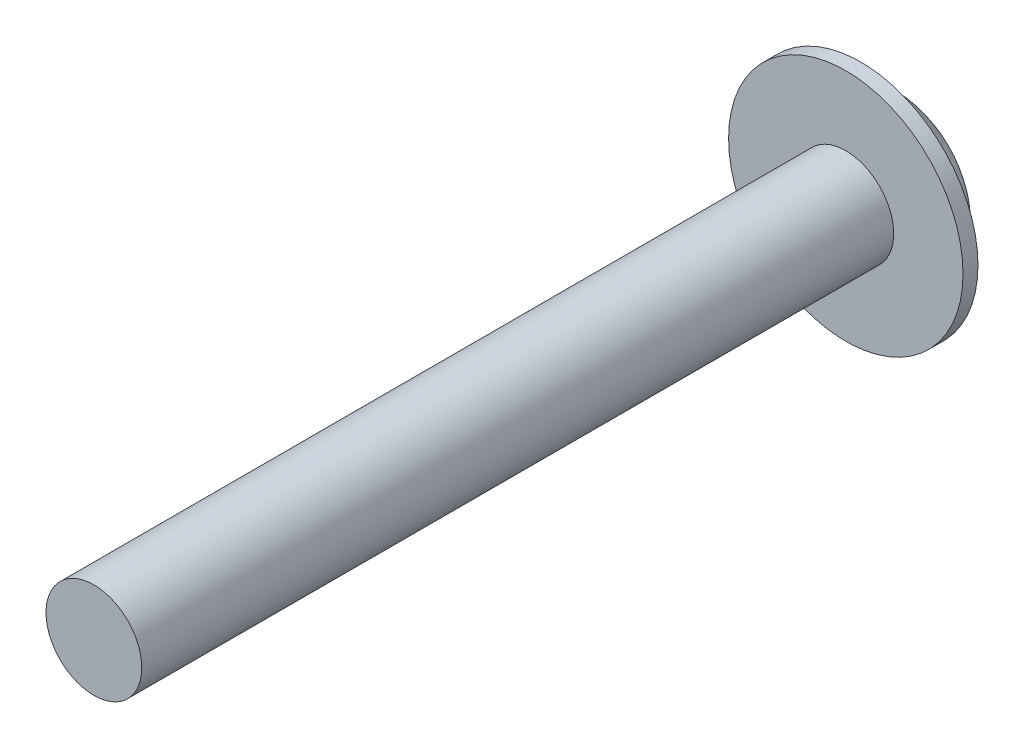
ISO-10303-21;
HEADER;
FILE_DESCRIPTION(('STEP AP214'),'2;1');
FILE_NAME('part.step','',(''),(''),'','','');
FILE_SCHEMA(('AUTOMOTIVE_DESIGN { 1 0 10303 214 1 1 1 1 }'));
ENDSEC;
DATA;
#1=APPLICATION_CONTEXT('core data for automotive mechanical design processes');
#2=APPLICATION_PROTOCOL_DEFINITION('international standard','automotive_design',2000,#1);
#3=PRODUCT_CONTEXT('',#1,'mechanical');
#4=PRODUCT('Part','Part','',(#3));
#5=PRODUCT_RELATED_PRODUCT_CATEGORY('part','',(#4));
#6=PRODUCT_DEFINITION_FORMATION('','',#4);
#7=PRODUCT_DEFINITION_CONTEXT('part definition',#1,'design');
#8=PRODUCT_DEFINITION('design','',#6,#7);
#9=PRODUCT_DEFINITION_SHAPE('','',#8);
#10=(LENGTH_UNIT() NAMED_UNIT(*) SI_UNIT(.MILLI.,.METRE.));
#11=(NAMED_UNIT(*) PLANE_ANGLE_UNIT() SI_UNIT($,.RADIAN.));
#12=(NAMED_UNIT(*) SI_UNIT($,.STERADIAN.) SOLID_ANGLE_UNIT());
#13=UNCERTAINTY_MEASURE_WITH_UNIT(LENGTH_MEASURE(1.E-05),#10,'distance_accuracy_value','');
#14=(GEOMETRIC_REPRESENTATION_CONTEXT(3) GLOBAL_UNCERTAINTY_ASSIGNED_CONTEXT((#13)) GLOBAL_UNIT_ASSIGNED_CONTEXT((#10,
#11,#12)) REPRESENTATION_CONTEXT('',''));
#15=CARTESIAN_POINT('',(0.,0.,0.));
#16=DIRECTION('',(0.,0.,1.));
#17=DIRECTION('',(1.,0.,0.));
#18=AXIS2_PLACEMENT_3D('',#15,#16,#17);
#19=CARTESIAN_POINT('',(0.,0.,-0.381));
#20=DIRECTION('',(0.,0.,-1.));
#21=DIRECTION('',(-1.,0.,0.));
#22=AXIS2_PLACEMENT_3D('',#19,#20,#21);
#23=PLANE('',#22);
#24=CARTESIAN_POINT('',(0.,0.,-0.381));
#25=DIRECTION('',(0.,0.,-1.));
#26=DIRECTION('',(-1.,0.,0.));
#27=AXIS2_PLACEMENT_3D('',#24,#25,#26);
#28=CIRCLE('',#27,2.9845);
#29=CARTESIAN_POINT('',(2.9845,0.,-0.381));
#30=VERTEX_POINT('',#29);
#31=EDGE_CURVE('E50',#30,#30,#28,.T.);
#32=ORIENTED_EDGE('',*,*,#31,.T.);
#33=EDGE_LOOP('',(#32));
#34=FACE_BOUND('',#33,.T.);
#35=CARTESIAN_POINT('',(0.,0.,-0.381));
#36=DIRECTION('',(0.,0.,-1.));
#37=DIRECTION('',(-1.,0.,0.));
#38=AXIS2_PLACEMENT_3D('',#35,#36,#37);
#39=CIRCLE('',#38,2.2479);
#40=CARTESIAN_POINT('',(-2.2479,0.,-0.381));
#41=VERTEX_POINT('',#40);
#42=EDGE_CURVE('E54',#41,#41,#39,.T.);
#43=ORIENTED_EDGE('',*,*,#42,.F.);
#44=EDGE_LOOP('',(#43));
#45=FACE_BOUND('',#44,.T.);
#46=ADVANCED_FACE('F30',(#34,#45),#23,.T.);
#47=CARTESIAN_POINT('',(0.,0.,19.144));
#48=DIRECTION('',(0.,0.,-1.));
#49=DIRECTION('',(-1.,0.,0.));
#50=AXIS2_PLACEMENT_3D('',#47,#48,#49);
#51=CYLINDRICAL_SURFACE('',#50,1.2192);
#52=CARTESIAN_POINT('',(0.,0.,19.144));
#53=DIRECTION('',(0.,0.,1.));
#54=DIRECTION('',(1.,0.,0.));
#55=AXIS2_PLACEMENT_3D('',#52,#53,#54);
#56=CIRCLE('',#55,1.2192);
#57=CARTESIAN_POINT('',(1.2192,0.,19.144));
#58=VERTEX_POINT('',#57);
#59=EDGE_CURVE('E41',#58,#58,#56,.T.);
#60=ORIENTED_EDGE('',*,*,#59,.F.);
#61=EDGE_LOOP('',(#60));
#62=FACE_BOUND('',#61,.T.);
#63=CARTESIAN_POINT('',(0.,0.,0.));
#64=DIRECTION('',(0.,0.,-1.));
#65=DIRECTION('',(-1.,0.,0.));
#66=AXIS2_PLACEMENT_3D('',#63,#64,#65);
#67=CIRCLE('',#66,1.2192);
#68=CARTESIAN_POINT('',(-1.2192,0.,0.));
#69=VERTEX_POINT('',#68);
#70=EDGE_CURVE('E45',#69,#69,#67,.T.);
#71=ORIENTED_EDGE('',*,*,#70,.F.);
#72=EDGE_LOOP('',(#71));
#73=FACE_BOUND('',#72,.T.);
#74=ADVANCED_FACE('F63',(#62,#73),#51,.T.);
#75=CARTESIAN_POINT('',(0.,0.,19.144));
#76=DIRECTION('',(0.,0.,1.));
#77=DIRECTION('',(1.,0.,0.));
#78=AXIS2_PLACEMENT_3D('',#75,#76,#77);
#79=PLANE('',#78);
#80=ORIENTED_EDGE('',*,*,#59,.T.);
#81=EDGE_LOOP('',(#80));
#82=FACE_BOUND('',#81,.T.);
#83=ADVANCED_FACE('F69',(#82),#79,.T.);
#84=CARTESIAN_POINT('',(0.,0.,0.));
#85=DIRECTION('',(0.,0.,-1.));
#86=DIRECTION('',(-1.,0.,0.));
#87=AXIS2_PLACEMENT_3D('',#84,#85,#86);
#88=PLANE('',#87);
#89=CARTESIAN_POINT('',(0.,0.,0.));
#90=DIRECTION('',(0.,0.,-1.));
#91=DIRECTION('',(-1.,0.,0.));
#92=AXIS2_PLACEMENT_3D('',#89,#90,#91);
#93=CIRCLE('',#92,2.9845);
#94=CARTESIAN_POINT('',(2.9845,0.,0.));
#95=VERTEX_POINT('',#94);
#96=EDGE_CURVE('E51',#95,#95,#93,.T.);
#97=ORIENTED_EDGE('',*,*,#96,.F.);
#98=EDGE_LOOP('',(#97));
#99=FACE_BOUND('',#98,.T.);
#100=ORIENTED_EDGE('',*,*,#70,.T.);
#101=EDGE_LOOP('',(#100));
#102=FACE_BOUND('',#101,.T.);
#103=ADVANCED_FACE('F74',(#99,#102),#88,.F.);
#104=CARTESIAN_POINT('',(0.,0.,-0.381));
#105=DIRECTION('',(0.,0.,1.));
#106=DIRECTION('',(1.,0.,0.));
#107=AXIS2_PLACEMENT_3D('',#104,#105,#106);
#108=CYLINDRICAL_SURFACE('',#107,2.9845);
#109=CARTESIAN_POINT('',(2.9845,0.,-0.381));
#110=CARTESIAN_POINT('',(2.9845,0.,-0.37703125));
#111=CARTESIAN_POINT('',(2.9845,0.,-0.3730625));
#112=CARTESIAN_POINT('',(2.9845,0.,-0.365125));
#113=CARTESIAN_POINT('',(2.9845,0.,-0.36115625));
#114=CARTESIAN_POINT('',(2.9845,0.,-0.35321875));
#115=CARTESIAN_POINT('',(2.9845,0.,-0.34925));
#116=CARTESIAN_POINT('',(2.9845,0.,-0.3413125));
#117=CARTESIAN_POINT('',(2.9845,0.,-0.33734375));
#118=CARTESIAN_POINT('',(2.9845,0.,-0.32940625));
#119=CARTESIAN_POINT('',(2.9845,0.,-0.3254375));
#120=CARTESIAN_POINT('',(2.9845,0.,-0.3175));
#121=CARTESIAN_POINT('',(2.9845,0.,-0.31353125));
#122=CARTESIAN_POINT('',(2.9845,0.,-0.30559375));
#123=CARTESIAN_POINT('',(2.9845,0.,-0.301625));
#124=CARTESIAN_POINT('',(2.9845,0.,-0.2936875));
#125=CARTESIAN_POINT('',(2.9845,0.,-0.28971875));
#126=CARTESIAN_POINT('',(2.9845,0.,-0.28178125));
#127=CARTESIAN_POINT('',(2.9845,0.,-0.2778125));
#128=CARTESIAN_POINT('',(2.9845,0.,-0.269875));
#129=CARTESIAN_POINT('',(2.9845,0.,-0.26590625));
#130=CARTESIAN_POINT('',(2.9845,0.,-0.25796875));
#131=CARTESIAN_POINT('',(2.9845,0.,-0.254));
#132=CARTESIAN_POINT('',(2.9845,0.,-0.2460625));
#133=CARTESIAN_POINT('',(2.9845,0.,-0.24209375));
#134=CARTESIAN_POINT('',(2.9845,0.,-0.23415625));
#135=CARTESIAN_POINT('',(2.9845,0.,-0.2301875));
#136=CARTESIAN_POINT('',(2.9845,0.,-0.22225));
#137=CARTESIAN_POINT('',(2.9845,0.,-0.21828125));
#138=CARTESIAN_POINT('',(2.9845,0.,-0.21034375));
#139=CARTESIAN_POINT('',(2.9845,0.,-0.206375));
#140=CARTESIAN_POINT('',(2.9845,0.,-0.1984375));
#141=CARTESIAN_POINT('',(2.9845,0.,-0.19446875));
#142=CARTESIAN_POINT('',(2.9845,0.,-0.18653125));
#143=CARTESIAN_POINT('',(2.9845,0.,-0.1825625));
#144=CARTESIAN_POINT('',(2.9845,0.,-0.174625));
#145=CARTESIAN_POINT('',(2.9845,0.,-0.17065625));
#146=CARTESIAN_POINT('',(2.9845,0.,-0.16271875));
#147=CARTESIAN_POINT('',(2.9845,0.,-0.15875));
#148=CARTESIAN_POINT('',(2.9845,0.,-0.1508125));
#149=CARTESIAN_POINT('',(2.9845,0.,-0.14684375));
#150=CARTESIAN_POINT('',(2.9845,0.,-0.13890625));
#151=CARTESIAN_POINT('',(2.9845,0.,-0.1349375));
#152=CARTESIAN_POINT('',(2.9845,0.,-0.127));
#153=CARTESIAN_POINT('',(2.9845,0.,-0.12303125));
#154=CARTESIAN_POINT('',(2.9845,0.,-0.11509375));
#155=CARTESIAN_POINT('',(2.9845,0.,-0.111125));
#156=CARTESIAN_POINT('',(2.9845,0.,-0.1031875));
#157=CARTESIAN_POINT('',(2.9845,0.,-0.09921875));
#158=CARTESIAN_POINT('',(2.9845,0.,-0.09128125));
#159=CARTESIAN_POINT('',(2.9845,0.,-0.0873125));
#160=CARTESIAN_POINT('',(2.9845,0.,-0.079375));
#161=CARTESIAN_POINT('',(2.9845,0.,-0.07540625));
#162=CARTESIAN_POINT('',(2.9845,0.,-0.06746875));
#163=CARTESIAN_POINT('',(2.9845,0.,-0.0635));
#164=CARTESIAN_POINT('',(2.9845,0.,-0.0555625));
#165=CARTESIAN_POINT('',(2.9845,0.,-0.05159375));
#166=CARTESIAN_POINT('',(2.9845,0.,-0.04365625));
#167=CARTESIAN_POINT('',(2.9845,0.,-0.0396875));
#168=CARTESIAN_POINT('',(2.9845,0.,-0.03175));
#169=CARTESIAN_POINT('',(2.9845,0.,-0.02778125));
#170=CARTESIAN_POINT('',(2.9845,0.,-0.01984375));
#171=CARTESIAN_POINT('',(2.9845,0.,-0.015875));
#172=CARTESIAN_POINT('',(2.9845,0.,-0.00793749999999999));
#173=CARTESIAN_POINT('',(2.9845,0.,-0.00396874999999999));
#174=CARTESIAN_POINT('',(2.9845,0.,0.));
#175=B_SPLINE_CURVE_WITH_KNOTS('',3,(#109,#110,#111,#112,#113,#114,#115,#116,#117,#118,#119,
#120,#121,#122,#123,#124,#125,#126,#127,#128,#129,#130,#131,#132,#133,#134,#135,#136,#137,#138,
#139,#140,#141,#142,#143,#144,#145,#146,#147,#148,#149,#150,#151,#152,#153,#154,#155,#156,#157,
#158,#159,#160,#161,#162,#163,#164,#165,#166,#167,#168,#169,#170,#171,#172,#173,#174),
.UNSPECIFIED.,.F.,.F.,(4,2,2,2,2,2,2,2,2,2,2,2,2,2,2,2,2,2,2,2,2,2,2,2,2,2,2,2,2,2,2,2,4),(0.,
0.01190625,0.0238125,0.0357187499999999,0.047625,0.05953125,0.0714374999999999,0.08334375,
0.09525,0.10715625,0.1190625,0.13096875,0.142875,0.15478125,0.1666875,0.17859375,0.1905,
0.20240625,0.2143125,0.22621875,0.238125,0.25003125,0.2619375,0.27384375,0.28575,0.29765625,
0.3095625,0.32146875,0.333375,0.34528125,0.3571875,0.36909375,0.381),.UNSPECIFIED.);
#176=EDGE_CURVE('BSEAM77',#30,#95,#175,.T.);
#177=ORIENTED_EDGE('',*,*,#31,.F.);
#178=ORIENTED_EDGE('',*,*,#96,.T.);
#179=ORIENTED_EDGE('',*,*,#176,.T.);
#180=ORIENTED_EDGE('',*,*,#176,.F.);
#181=EDGE_LOOP('',(#177,#179,#178,#180));
#182=FACE_BOUND('',#181,.T.);
#183=ADVANCED_FACE('F77',(#182),#108,.T.);
#184=CARTESIAN_POINT('',(0.,0.,-1.524));
#185=DIRECTION('',(0.,0.,1.));
#186=DIRECTION('',(1.,0.,0.));
#187=AXIS2_PLACEMENT_3D('',#184,#185,#186);
#188=CYLINDRICAL_SURFACE('',#187,2.2479);
#189=CARTESIAN_POINT('',(0.,0.,-0.508));
#190=DIRECTION('',(0.,0.,-1.));
#191=DIRECTION('',(-1.,0.,0.));
#192=AXIS2_PLACEMENT_3D('',#189,#190,#191);
#193=CIRCLE('',#192,2.2479);
#194=CARTESIAN_POINT('',(-2.2479,0.,-0.508));
#195=VERTEX_POINT('',#194);
#196=EDGE_CURVE('E10',#195,#195,#193,.F.);
#197=ORIENTED_EDGE('',*,*,#196,.T.);
#198=EDGE_LOOP('',(#197));
#199=FACE_BOUND('',#198,.T.);
#200=ORIENTED_EDGE('',*,*,#42,.T.);
#201=EDGE_LOOP('',(#200));
#202=FACE_BOUND('',#201,.T.);
#203=ADVANCED_FACE('F60',(#199,#202),#188,.T.);
#204=CARTESIAN_POINT('',(0.,0.,-1.524));
#205=DIRECTION('',(0.,0.,-1.));
#206=DIRECTION('',(-1.,0.,0.));
#207=AXIS2_PLACEMENT_3D('',#204,#205,#206);
#208=PLANE('',#207);
#209=CARTESIAN_POINT('',(0.,0.,-1.524));
#210=DIRECTION('',(0.,0.,-1.));
#211=DIRECTION('',(-1.,0.,0.));
#212=AXIS2_PLACEMENT_3D('',#209,#210,#211);
#213=CIRCLE('',#212,1.2319);
#214=CARTESIAN_POINT('',(-1.2319,0.,-1.524));
#215=VERTEX_POINT('',#214);
#216=EDGE_CURVE('E37',#215,#215,#213,.T.);
#217=ORIENTED_EDGE('',*,*,#216,.T.);
#218=EDGE_LOOP('',(#217));
#219=FACE_BOUND('',#218,.T.);
#220=ADVANCED_FACE('F106',(#219),#208,.T.);
#221=CARTESIAN_POINT('',(0.,0.,-0.508));
#222=DIRECTION('',(0.,0.,-1.));
#223=DIRECTION('',(-1.,0.,0.));
#224=AXIS2_PLACEMENT_3D('',#221,#222,#223);
#225=TOROIDAL_SURFACE('',#224,1.2319,1.016);
#226=ORIENTED_EDGE('',*,*,#196,.F.);
#227=EDGE_LOOP('',(#226));
#228=FACE_BOUND('',#227,.T.);
#229=ORIENTED_EDGE('',*,*,#216,.F.);
#230=EDGE_LOOP('',(#229));
#231=FACE_BOUND('',#230,.T.);
#232=ADVANCED_FACE('F32',(#228,#231),#225,.T.);
#233=CLOSED_SHELL('',(#46,#74,#83,#103,#183,#203,#220,#232));
#234=MANIFOLD_SOLID_BREP('B2',#233);
#235=ADVANCED_BREP_SHAPE_REPRESENTATION('',(#18,#234),#14);
#236=SHAPE_DEFINITION_REPRESENTATION(#9,#235);
ENDSEC;
END-ISO-10303-21;
